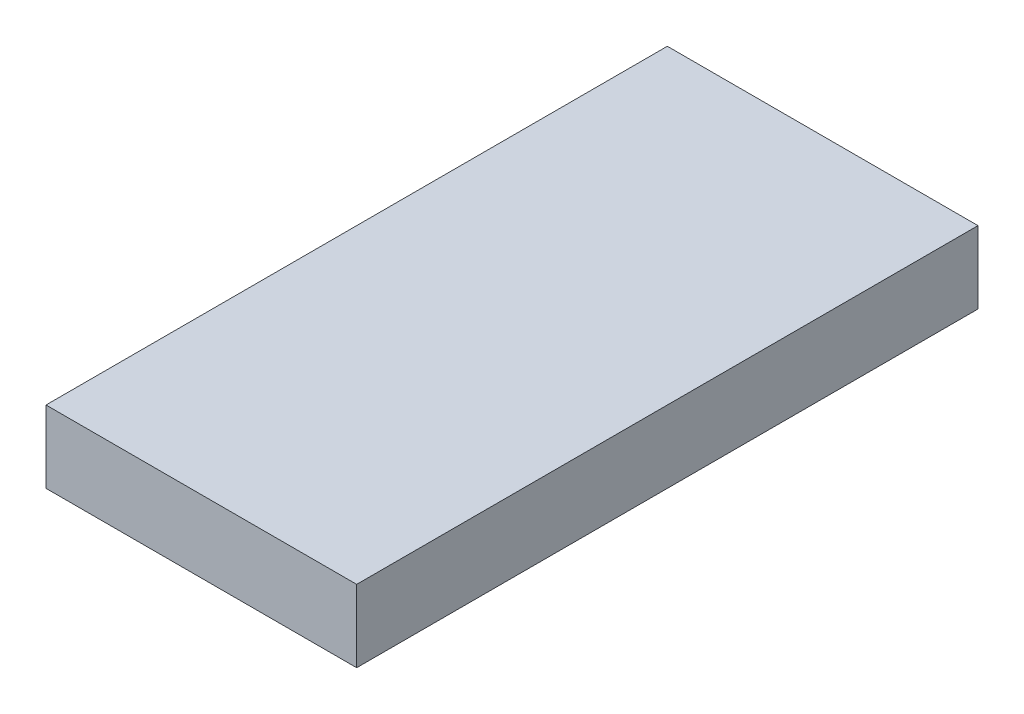
ISO-10303-21;
HEADER;
FILE_DESCRIPTION(('STEP AP214'),'2;1');
FILE_NAME('part.step','',(''),(''),'','','');
FILE_SCHEMA(('AUTOMOTIVE_DESIGN { 1 0 10303 214 1 1 1 1 }'));
ENDSEC;
DATA;
#1=APPLICATION_CONTEXT('core data for automotive mechanical design processes');
#2=APPLICATION_PROTOCOL_DEFINITION('international standard','automotive_design',2000,#1);
#3=PRODUCT_CONTEXT('',#1,'mechanical');
#4=PRODUCT('Part','Part','',(#3));
#5=PRODUCT_RELATED_PRODUCT_CATEGORY('part','',(#4));
#6=PRODUCT_DEFINITION_FORMATION('','',#4);
#7=PRODUCT_DEFINITION_CONTEXT('part definition',#1,'design');
#8=PRODUCT_DEFINITION('design','',#6,#7);
#9=PRODUCT_DEFINITION_SHAPE('','',#8);
#10=(LENGTH_UNIT() NAMED_UNIT(*) SI_UNIT(.MILLI.,.METRE.));
#11=(NAMED_UNIT(*) PLANE_ANGLE_UNIT() SI_UNIT($,.RADIAN.));
#12=(NAMED_UNIT(*) SI_UNIT($,.STERADIAN.) SOLID_ANGLE_UNIT());
#13=UNCERTAINTY_MEASURE_WITH_UNIT(LENGTH_MEASURE(1.E-05),#10,'distance_accuracy_value','');
#14=(GEOMETRIC_REPRESENTATION_CONTEXT(3) GLOBAL_UNCERTAINTY_ASSIGNED_CONTEXT((#13)) GLOBAL_UNIT_ASSIGNED_CONTEXT((#10,
#11,#12)) REPRESENTATION_CONTEXT('',''));
#15=CARTESIAN_POINT('',(0.,0.,0.));
#16=DIRECTION('',(0.,0.,1.));
#17=DIRECTION('',(1.,0.,0.));
#18=AXIS2_PLACEMENT_3D('',#15,#16,#17);
#19=CARTESIAN_POINT('',(-295.887161946764,11.81,-616.100570036335));
#20=DIRECTION('',(-1.,0.,0.));
#21=DIRECTION('',(0.,0.,1.));
#22=AXIS2_PLACEMENT_3D('',#19,#20,#21);
#23=PLANE('',#22);
#24=DIRECTION('',(0.,0.,-1.));
#25=VECTOR('',#24,1.);
#26=CARTESIAN_POINT('',(-295.887161946764,0.,-616.100570036335));
#27=LINE('',#26,#25);
#28=CARTESIAN_POINT('',(-295.887161946764,0.,-514.500570036335));
#29=VERTEX_POINT('',#28);
#30=CARTESIAN_POINT('',(-295.887161946764,0.,-616.100570036335));
#31=VERTEX_POINT('',#30);
#32=EDGE_CURVE('E97',#29,#31,#27,.T.);
#33=ORIENTED_EDGE('',*,*,#32,.T.);
#34=DIRECTION('',(0.,-1.,0.));
#35=VECTOR('',#34,1.);
#36=CARTESIAN_POINT('',(-295.887161946764,11.81,-616.100570036335));
#37=LINE('',#36,#35);
#38=CARTESIAN_POINT('',(-295.887161946764,11.81,-616.100570036335));
#39=VERTEX_POINT('',#38);
#40=EDGE_CURVE('E11',#39,#31,#37,.T.);
#41=ORIENTED_EDGE('',*,*,#40,.F.);
#42=DIRECTION('',(0.,0.,-1.));
#43=VECTOR('',#42,1.);
#44=CARTESIAN_POINT('',(-295.887161946764,11.81,-616.100570036335));
#45=LINE('',#44,#43);
#46=CARTESIAN_POINT('',(-295.887161946764,11.81,-514.500570036335));
#47=VERTEX_POINT('',#46);
#48=EDGE_CURVE('E85',#47,#39,#45,.T.);
#49=ORIENTED_EDGE('',*,*,#48,.F.);
#50=DIRECTION('',(0.,-1.,0.));
#51=VECTOR('',#50,1.);
#52=CARTESIAN_POINT('',(-295.887161946764,11.81,-514.500570036335));
#53=LINE('',#52,#51);
#54=EDGE_CURVE('E93',#47,#29,#53,.T.);
#55=ORIENTED_EDGE('',*,*,#54,.T.);
#56=EDGE_LOOP('',(#33,#41,#49,#55));
#57=FACE_BOUND('',#56,.T.);
#58=ADVANCED_FACE('F34',(#57),#23,.F.);
#59=CARTESIAN_POINT('',(-346.687161946764,11.81,-616.100570036334));
#60=DIRECTION('',(0.,0.,1.));
#61=DIRECTION('',(1.,0.,0.));
#62=AXIS2_PLACEMENT_3D('',#59,#60,#61);
#63=PLANE('',#62);
#64=DIRECTION('',(-1.,0.,0.));
#65=VECTOR('',#64,1.);
#66=CARTESIAN_POINT('',(-346.687161946764,0.,-616.100570036334));
#67=LINE('',#66,#65);
#68=CARTESIAN_POINT('',(-346.687161946764,0.,-616.100570036334));
#69=VERTEX_POINT('',#68);
#70=EDGE_CURVE('E89',#31,#69,#67,.T.);
#71=ORIENTED_EDGE('',*,*,#70,.T.);
#72=DIRECTION('',(0.,-1.,0.));
#73=VECTOR('',#72,1.);
#74=CARTESIAN_POINT('',(-346.687161946764,11.81,-616.100570036334));
#75=LINE('',#74,#73);
#76=CARTESIAN_POINT('',(-346.687161946764,11.81,-616.100570036334));
#77=VERTEX_POINT('',#76);
#78=EDGE_CURVE('E42',#77,#69,#75,.T.);
#79=ORIENTED_EDGE('',*,*,#78,.F.);
#80=DIRECTION('',(-1.,0.,0.));
#81=VECTOR('',#80,1.);
#82=CARTESIAN_POINT('',(-346.687161946764,11.81,-616.100570036334));
#83=LINE('',#82,#81);
#84=EDGE_CURVE('E80',#39,#77,#83,.T.);
#85=ORIENTED_EDGE('',*,*,#84,.F.);
#86=ORIENTED_EDGE('',*,*,#40,.T.);
#87=EDGE_LOOP('',(#71,#79,#85,#86));
#88=FACE_BOUND('',#87,.T.);
#89=ADVANCED_FACE('F88',(#88),#63,.F.);
#90=CARTESIAN_POINT('',(-346.687161946764,11.81,-616.100570036334));
#91=DIRECTION('',(1.,0.,0.));
#92=DIRECTION('',(0.,0.,-1.));
#93=AXIS2_PLACEMENT_3D('',#90,#91,#92);
#94=PLANE('',#93);
#95=DIRECTION('',(0.,0.,1.));
#96=VECTOR('',#95,1.);
#97=CARTESIAN_POINT('',(-346.687161946764,0.,-616.100570036334));
#98=LINE('',#97,#96);
#99=CARTESIAN_POINT('',(-346.687161946764,0.,-514.500570036335));
#100=VERTEX_POINT('',#99);
#101=EDGE_CURVE('E67',#69,#100,#98,.T.);
#102=ORIENTED_EDGE('',*,*,#101,.T.);
#103=DIRECTION('',(0.,-1.,0.));
#104=VECTOR('',#103,1.);
#105=CARTESIAN_POINT('',(-346.687161946764,11.81,-514.500570036335));
#106=LINE('',#105,#104);
#107=CARTESIAN_POINT('',(-346.687161946764,11.81,-514.500570036335));
#108=VERTEX_POINT('',#107);
#109=EDGE_CURVE('E90',#108,#100,#106,.T.);
#110=ORIENTED_EDGE('',*,*,#109,.F.);
#111=DIRECTION('',(0.,0.,1.));
#112=VECTOR('',#111,1.);
#113=CARTESIAN_POINT('',(-346.687161946764,11.81,-616.100570036334));
#114=LINE('',#113,#112);
#115=EDGE_CURVE('E83',#77,#108,#114,.T.);
#116=ORIENTED_EDGE('',*,*,#115,.F.);
#117=ORIENTED_EDGE('',*,*,#78,.T.);
#118=EDGE_LOOP('',(#102,#110,#116,#117));
#119=FACE_BOUND('',#118,.T.);
#120=ADVANCED_FACE('F91',(#119),#94,.F.);
#121=CARTESIAN_POINT('',(-346.687161946764,11.81,-514.500570036335));
#122=DIRECTION('',(0.,0.,-1.));
#123=DIRECTION('',(-1.,0.,0.));
#124=AXIS2_PLACEMENT_3D('',#121,#122,#123);
#125=PLANE('',#124);
#126=DIRECTION('',(1.,0.,0.));
#127=VECTOR('',#126,1.);
#128=CARTESIAN_POINT('',(-346.687161946764,0.,-514.500570036335));
#129=LINE('',#128,#127);
#130=EDGE_CURVE('E73',#100,#29,#129,.T.);
#131=ORIENTED_EDGE('',*,*,#130,.T.);
#132=ORIENTED_EDGE('',*,*,#54,.F.);
#133=DIRECTION('',(1.,0.,0.));
#134=VECTOR('',#133,1.);
#135=CARTESIAN_POINT('',(-346.687161946764,11.81,-514.500570036335));
#136=LINE('',#135,#134);
#137=EDGE_CURVE('E50',#108,#47,#136,.T.);
#138=ORIENTED_EDGE('',*,*,#137,.F.);
#139=ORIENTED_EDGE('',*,*,#109,.T.);
#140=EDGE_LOOP('',(#131,#132,#138,#139));
#141=FACE_BOUND('',#140,.T.);
#142=ADVANCED_FACE('F104',(#141),#125,.F.);
#143=CARTESIAN_POINT('',(0.,11.81,0.));
#144=DIRECTION('',(0.,1.,0.));
#145=DIRECTION('',(0.,0.,1.));
#146=AXIS2_PLACEMENT_3D('',#143,#144,#145);
#147=PLANE('',#146);
#148=ORIENTED_EDGE('',*,*,#48,.T.);
#149=ORIENTED_EDGE('',*,*,#84,.T.);
#150=ORIENTED_EDGE('',*,*,#115,.T.);
#151=ORIENTED_EDGE('',*,*,#137,.T.);
#152=EDGE_LOOP('',(#148,#149,#150,#151));
#153=FACE_BOUND('',#152,.T.);
#154=ADVANCED_FACE('F81',(#153),#147,.T.);
#155=CARTESIAN_POINT('',(0.,0.,0.));
#156=DIRECTION('',(0.,1.,0.));
#157=DIRECTION('',(0.,0.,1.));
#158=AXIS2_PLACEMENT_3D('',#155,#156,#157);
#159=PLANE('',#158);
#160=ORIENTED_EDGE('',*,*,#32,.F.);
#161=ORIENTED_EDGE('',*,*,#130,.F.);
#162=ORIENTED_EDGE('',*,*,#101,.F.);
#163=ORIENTED_EDGE('',*,*,#70,.F.);
#164=EDGE_LOOP('',(#160,#161,#162,#163));
#165=FACE_BOUND('',#164,.T.);
#166=ADVANCED_FACE('F107',(#165),#159,.F.);
#167=CLOSED_SHELL('',(#58,#89,#120,#142,#154,#166));
#168=MANIFOLD_SOLID_BREP('B2',#167);
#169=ADVANCED_BREP_SHAPE_REPRESENTATION('',(#18,#168),#14);
#170=SHAPE_DEFINITION_REPRESENTATION(#9,#169);
ENDSEC;
END-ISO-10303-21;
